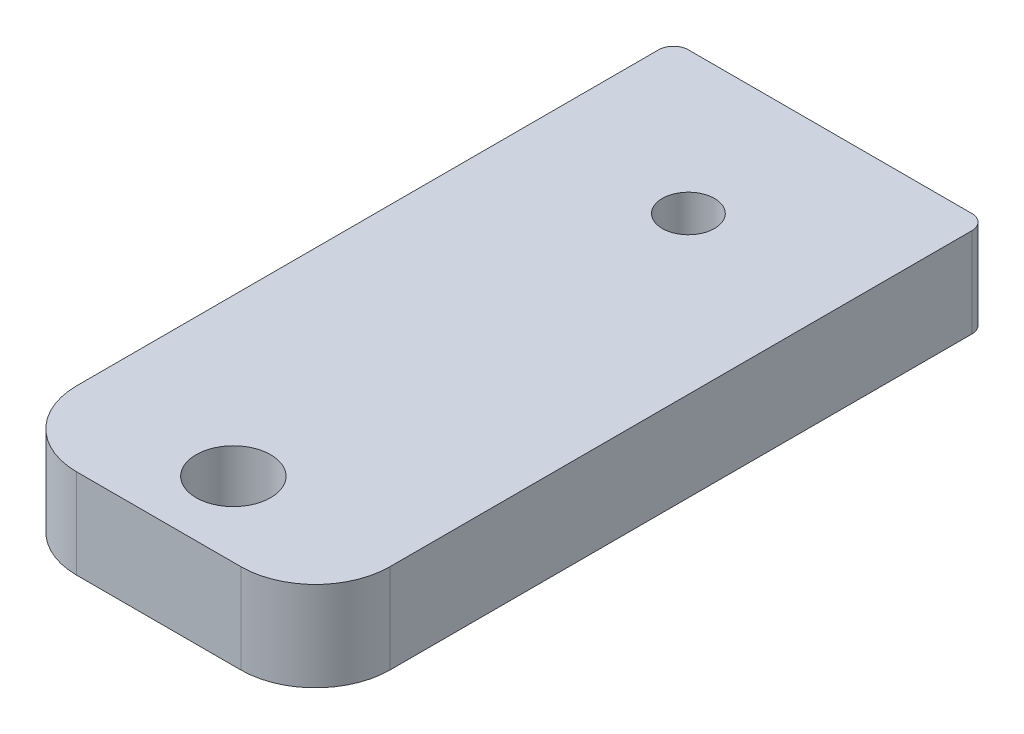
ISO-10303-21;
HEADER;
FILE_DESCRIPTION(('STEP AP214'),'2;1');
FILE_NAME('part.step','',(''),(''),'','','');
FILE_SCHEMA(('AUTOMOTIVE_DESIGN { 1 0 10303 214 1 1 1 1 }'));
ENDSEC;
DATA;
#1=APPLICATION_CONTEXT('core data for automotive mechanical design processes');
#2=APPLICATION_PROTOCOL_DEFINITION('international standard','automotive_design',2000,#1);
#3=PRODUCT_CONTEXT('',#1,'mechanical');
#4=PRODUCT('Part','Part','',(#3));
#5=PRODUCT_RELATED_PRODUCT_CATEGORY('part','',(#4));
#6=PRODUCT_DEFINITION_FORMATION('','',#4);
#7=PRODUCT_DEFINITION_CONTEXT('part definition',#1,'design');
#8=PRODUCT_DEFINITION('design','',#6,#7);
#9=PRODUCT_DEFINITION_SHAPE('','',#8);
#10=(LENGTH_UNIT() NAMED_UNIT(*) SI_UNIT(.MILLI.,.METRE.));
#11=(NAMED_UNIT(*) PLANE_ANGLE_UNIT() SI_UNIT($,.RADIAN.));
#12=(NAMED_UNIT(*) SI_UNIT($,.STERADIAN.) SOLID_ANGLE_UNIT());
#13=UNCERTAINTY_MEASURE_WITH_UNIT(LENGTH_MEASURE(1.E-05),#10,'distance_accuracy_value','');
#14=(GEOMETRIC_REPRESENTATION_CONTEXT(3) GLOBAL_UNCERTAINTY_ASSIGNED_CONTEXT((#13)) GLOBAL_UNIT_ASSIGNED_CONTEXT((#10,
#11,#12)) REPRESENTATION_CONTEXT('',''));
#15=CARTESIAN_POINT('',(0.,0.,0.));
#16=DIRECTION('',(0.,0.,1.));
#17=DIRECTION('',(1.,0.,0.));
#18=AXIS2_PLACEMENT_3D('',#15,#16,#17);
#19=CARTESIAN_POINT('',(5.5,6.,19.5));
#20=DIRECTION('',(0.,1.,0.));
#21=DIRECTION('',(0.,0.,1.));
#22=AXIS2_PLACEMENT_3D('',#19,#20,#21);
#23=PLANE('',#22);
#24=CARTESIAN_POINT('',(0.,6.,-11.));
#25=DIRECTION('',(0.,1.,0.));
#26=DIRECTION('',(0.,0.,1.));
#27=AXIS2_PLACEMENT_3D('',#24,#25,#26);
#28=CIRCLE('',#27,1.75);
#29=CARTESIAN_POINT('',(0.,6.,-9.24999999999999));
#30=VERTEX_POINT('',#29);
#31=EDGE_CURVE('E134',#30,#30,#28,.T.);
#32=ORIENTED_EDGE('',*,*,#31,.F.);
#33=EDGE_LOOP('',(#32));
#34=FACE_BOUND('',#33,.T.);
#35=CARTESIAN_POINT('',(5.5,6.,19.5));
#36=DIRECTION('',(0.,1.,0.));
#37=DIRECTION('',(0.,0.,1.));
#38=AXIS2_PLACEMENT_3D('',#35,#36,#37);
#39=CIRCLE('',#38,5.);
#40=CARTESIAN_POINT('',(5.5,6.,24.5));
#41=VERTEX_POINT('',#40);
#42=CARTESIAN_POINT('',(10.5,6.,19.5));
#43=VERTEX_POINT('',#42);
#44=EDGE_CURVE('E145',#41,#43,#39,.T.);
#45=ORIENTED_EDGE('',*,*,#44,.T.);
#46=DIRECTION('',(0.,0.,-1.));
#47=VECTOR('',#46,1.);
#48=CARTESIAN_POINT('',(10.5,6.,19.5));
#49=LINE('',#48,#47);
#50=CARTESIAN_POINT('',(10.5,6.,-19.5));
#51=VERTEX_POINT('',#50);
#52=EDGE_CURVE('E93',#43,#51,#49,.T.);
#53=ORIENTED_EDGE('',*,*,#52,.T.);
#54=CARTESIAN_POINT('',(9.50000000000001,6.,-19.5));
#55=DIRECTION('',(0.,1.,0.));
#56=DIRECTION('',(0.,0.,-1.));
#57=AXIS2_PLACEMENT_3D('',#54,#55,#56);
#58=CIRCLE('',#57,0.999999999999994);
#59=CARTESIAN_POINT('',(9.50000000000001,6.,-20.5));
#60=VERTEX_POINT('',#59);
#61=EDGE_CURVE('E160',#51,#60,#58,.T.);
#62=ORIENTED_EDGE('',*,*,#61,.T.);
#63=DIRECTION('',(-1.,0.,0.));
#64=VECTOR('',#63,1.);
#65=CARTESIAN_POINT('',(-9.50000000000001,6.,-20.5));
#66=LINE('',#65,#64);
#67=CARTESIAN_POINT('',(-9.50000000000001,6.,-20.5));
#68=VERTEX_POINT('',#67);
#69=EDGE_CURVE('E173',#60,#68,#66,.T.);
#70=ORIENTED_EDGE('',*,*,#69,.T.);
#71=CARTESIAN_POINT('',(-9.50000000000001,6.,-19.5));
#72=DIRECTION('',(0.,1.,0.));
#73=DIRECTION('',(0.,0.,-1.));
#74=AXIS2_PLACEMENT_3D('',#71,#72,#73);
#75=CIRCLE('',#74,0.999999999999994);
#76=CARTESIAN_POINT('',(-10.5,6.,-19.5));
#77=VERTEX_POINT('',#76);
#78=EDGE_CURVE('E112',#68,#77,#75,.T.);
#79=ORIENTED_EDGE('',*,*,#78,.T.);
#80=DIRECTION('',(0.,0.,1.));
#81=VECTOR('',#80,1.);
#82=CARTESIAN_POINT('',(-10.5,6.,19.5));
#83=LINE('',#82,#81);
#84=CARTESIAN_POINT('',(-10.5,6.,19.5));
#85=VERTEX_POINT('',#84);
#86=EDGE_CURVE('E106',#77,#85,#83,.T.);
#87=ORIENTED_EDGE('',*,*,#86,.T.);
#88=CARTESIAN_POINT('',(-5.5,6.,19.5));
#89=DIRECTION('',(0.,1.,0.));
#90=DIRECTION('',(0.,0.,-1.));
#91=AXIS2_PLACEMENT_3D('',#88,#89,#90);
#92=CIRCLE('',#91,5.);
#93=CARTESIAN_POINT('',(-5.49999999999999,6.,24.5));
#94=VERTEX_POINT('',#93);
#95=EDGE_CURVE('E110',#85,#94,#92,.T.);
#96=ORIENTED_EDGE('',*,*,#95,.T.);
#97=DIRECTION('',(1.,0.,0.));
#98=VECTOR('',#97,1.);
#99=CARTESIAN_POINT('',(-5.49999999999999,6.,24.5));
#100=LINE('',#99,#98);
#101=EDGE_CURVE('E50',#94,#41,#100,.T.);
#102=ORIENTED_EDGE('',*,*,#101,.T.);
#103=EDGE_LOOP('',(#45,#53,#62,#70,#79,#87,#96,#102));
#104=FACE_BOUND('',#103,.T.);
#105=CARTESIAN_POINT('',(0.,6.,19.5));
#106=DIRECTION('',(0.,1.,0.));
#107=DIRECTION('',(0.,0.,1.));
#108=AXIS2_PLACEMENT_3D('',#105,#106,#107);
#109=CIRCLE('',#108,2.5);
#110=CARTESIAN_POINT('',(0.,6.,22.));
#111=VERTEX_POINT('',#110);
#112=EDGE_CURVE('E182',#111,#111,#109,.T.);
#113=ORIENTED_EDGE('',*,*,#112,.F.);
#114=EDGE_LOOP('',(#113));
#115=FACE_BOUND('',#114,.T.);
#116=ADVANCED_FACE('F33',(#34,#104,#115),#23,.T.);
#117=CARTESIAN_POINT('',(5.5,0.,19.5));
#118=DIRECTION('',(0.,1.,0.));
#119=DIRECTION('',(0.,0.,1.));
#120=AXIS2_PLACEMENT_3D('',#117,#118,#119);
#121=PLANE('',#120);
#122=CARTESIAN_POINT('',(5.5,0.,19.5));
#123=DIRECTION('',(0.,1.,0.));
#124=DIRECTION('',(0.,0.,1.));
#125=AXIS2_PLACEMENT_3D('',#122,#123,#124);
#126=CIRCLE('',#125,5.);
#127=CARTESIAN_POINT('',(5.5,0.,24.5));
#128=VERTEX_POINT('',#127);
#129=CARTESIAN_POINT('',(10.5,0.,19.5));
#130=VERTEX_POINT('',#129);
#131=EDGE_CURVE('E130',#128,#130,#126,.T.);
#132=ORIENTED_EDGE('',*,*,#131,.F.);
#133=DIRECTION('',(1.,0.,0.));
#134=VECTOR('',#133,1.);
#135=CARTESIAN_POINT('',(-5.49999999999999,0.,24.5));
#136=LINE('',#135,#134);
#137=CARTESIAN_POINT('',(-5.49999999999999,0.,24.5));
#138=VERTEX_POINT('',#137);
#139=EDGE_CURVE('E85',#138,#128,#136,.T.);
#140=ORIENTED_EDGE('',*,*,#139,.F.);
#141=CARTESIAN_POINT('',(-5.5,0.,19.5));
#142=DIRECTION('',(0.,1.,0.));
#143=DIRECTION('',(0.,0.,-1.));
#144=AXIS2_PLACEMENT_3D('',#141,#142,#143);
#145=CIRCLE('',#144,5.);
#146=CARTESIAN_POINT('',(-10.5,0.,19.5));
#147=VERTEX_POINT('',#146);
#148=EDGE_CURVE('E79',#147,#138,#145,.T.);
#149=ORIENTED_EDGE('',*,*,#148,.F.);
#150=DIRECTION('',(0.,0.,1.));
#151=VECTOR('',#150,1.);
#152=CARTESIAN_POINT('',(-10.5,0.,19.5));
#153=LINE('',#152,#151);
#154=CARTESIAN_POINT('',(-10.5,0.,-19.5));
#155=VERTEX_POINT('',#154);
#156=EDGE_CURVE('E120',#155,#147,#153,.T.);
#157=ORIENTED_EDGE('',*,*,#156,.F.);
#158=CARTESIAN_POINT('',(-9.50000000000001,0.,-19.5));
#159=DIRECTION('',(0.,1.,0.));
#160=DIRECTION('',(0.,0.,-1.));
#161=AXIS2_PLACEMENT_3D('',#158,#159,#160);
#162=CIRCLE('',#161,0.999999999999994);
#163=CARTESIAN_POINT('',(-9.50000000000001,0.,-20.5));
#164=VERTEX_POINT('',#163);
#165=EDGE_CURVE('E140',#164,#155,#162,.T.);
#166=ORIENTED_EDGE('',*,*,#165,.F.);
#167=DIRECTION('',(-1.,0.,0.));
#168=VECTOR('',#167,1.);
#169=CARTESIAN_POINT('',(-9.50000000000001,0.,-20.5));
#170=LINE('',#169,#168);
#171=CARTESIAN_POINT('',(9.50000000000001,0.,-20.5));
#172=VERTEX_POINT('',#171);
#173=EDGE_CURVE('E138',#172,#164,#170,.T.);
#174=ORIENTED_EDGE('',*,*,#173,.F.);
#175=CARTESIAN_POINT('',(9.50000000000001,0.,-19.5));
#176=DIRECTION('',(0.,1.,0.));
#177=DIRECTION('',(0.,0.,-1.));
#178=AXIS2_PLACEMENT_3D('',#175,#176,#177);
#179=CIRCLE('',#178,0.999999999999994);
#180=CARTESIAN_POINT('',(10.5,0.,-19.5));
#181=VERTEX_POINT('',#180);
#182=EDGE_CURVE('E136',#181,#172,#179,.T.);
#183=ORIENTED_EDGE('',*,*,#182,.F.);
#184=DIRECTION('',(0.,0.,-1.));
#185=VECTOR('',#184,1.);
#186=CARTESIAN_POINT('',(10.5,0.,19.5));
#187=LINE('',#186,#185);
#188=EDGE_CURVE('E133',#130,#181,#187,.T.);
#189=ORIENTED_EDGE('',*,*,#188,.F.);
#190=EDGE_LOOP('',(#132,#140,#149,#157,#166,#174,#183,#189));
#191=FACE_BOUND('',#190,.T.);
#192=CARTESIAN_POINT('',(0.,0.,-11.));
#193=DIRECTION('',(0.,1.,0.));
#194=DIRECTION('',(0.,0.,1.));
#195=AXIS2_PLACEMENT_3D('',#192,#193,#194);
#196=CIRCLE('',#195,1.75);
#197=CARTESIAN_POINT('',(0.,0.,-9.24999999999999));
#198=VERTEX_POINT('',#197);
#199=EDGE_CURVE('E179',#198,#198,#196,.T.);
#200=ORIENTED_EDGE('',*,*,#199,.T.);
#201=EDGE_LOOP('',(#200));
#202=FACE_BOUND('',#201,.T.);
#203=CARTESIAN_POINT('',(0.,0.,19.5));
#204=DIRECTION('',(0.,1.,0.));
#205=DIRECTION('',(0.,0.,1.));
#206=AXIS2_PLACEMENT_3D('',#203,#204,#205);
#207=CIRCLE('',#206,2.5);
#208=CARTESIAN_POINT('',(0.,0.,22.));
#209=VERTEX_POINT('',#208);
#210=EDGE_CURVE('E185',#209,#209,#207,.T.);
#211=ORIENTED_EDGE('',*,*,#210,.T.);
#212=EDGE_LOOP('',(#211));
#213=FACE_BOUND('',#212,.T.);
#214=ADVANCED_FACE('F164',(#191,#202,#213),#121,.F.);
#215=CARTESIAN_POINT('',(5.5,6.,19.5));
#216=DIRECTION('',(0.,-1.,0.));
#217=DIRECTION('',(0.,0.,-1.));
#218=AXIS2_PLACEMENT_3D('',#215,#216,#217);
#219=CYLINDRICAL_SURFACE('',#218,5.);
#220=ORIENTED_EDGE('',*,*,#131,.T.);
#221=DIRECTION('',(0.,-1.,0.));
#222=VECTOR('',#221,1.);
#223=CARTESIAN_POINT('',(10.5,6.,19.5));
#224=LINE('',#223,#222);
#225=EDGE_CURVE('E11',#43,#130,#224,.T.);
#226=ORIENTED_EDGE('',*,*,#225,.F.);
#227=ORIENTED_EDGE('',*,*,#44,.F.);
#228=DIRECTION('',(0.,-1.,0.));
#229=VECTOR('',#228,1.);
#230=CARTESIAN_POINT('',(5.5,6.,24.5));
#231=LINE('',#230,#229);
#232=EDGE_CURVE('E126',#41,#128,#231,.T.);
#233=ORIENTED_EDGE('',*,*,#232,.T.);
#234=EDGE_LOOP('',(#220,#226,#227,#233));
#235=FACE_BOUND('',#234,.T.);
#236=ADVANCED_FACE('F35',(#235),#219,.T.);
#237=CARTESIAN_POINT('',(10.5,6.,19.5));
#238=DIRECTION('',(-1.,0.,0.));
#239=DIRECTION('',(0.,0.,1.));
#240=AXIS2_PLACEMENT_3D('',#237,#238,#239);
#241=PLANE('',#240);
#242=ORIENTED_EDGE('',*,*,#188,.T.);
#243=DIRECTION('',(0.,-1.,0.));
#244=VECTOR('',#243,1.);
#245=CARTESIAN_POINT('',(10.5,6.,-19.5));
#246=LINE('',#245,#244);
#247=EDGE_CURVE('E42',#51,#181,#246,.T.);
#248=ORIENTED_EDGE('',*,*,#247,.F.);
#249=ORIENTED_EDGE('',*,*,#52,.F.);
#250=ORIENTED_EDGE('',*,*,#225,.T.);
#251=EDGE_LOOP('',(#242,#248,#249,#250));
#252=FACE_BOUND('',#251,.T.);
#253=ADVANCED_FACE('F217',(#252),#241,.F.);
#254=CARTESIAN_POINT('',(9.50000000000001,6.,-19.5));
#255=DIRECTION('',(0.,-1.,0.));
#256=DIRECTION('',(0.,0.,-1.));
#257=AXIS2_PLACEMENT_3D('',#254,#255,#256);
#258=CYLINDRICAL_SURFACE('',#257,0.999999999999994);
#259=ORIENTED_EDGE('',*,*,#182,.T.);
#260=DIRECTION('',(0.,-1.,0.));
#261=VECTOR('',#260,1.);
#262=CARTESIAN_POINT('',(9.50000000000001,6.,-20.5));
#263=LINE('',#262,#261);
#264=EDGE_CURVE('E152',#60,#172,#263,.T.);
#265=ORIENTED_EDGE('',*,*,#264,.F.);
#266=ORIENTED_EDGE('',*,*,#61,.F.);
#267=ORIENTED_EDGE('',*,*,#247,.T.);
#268=EDGE_LOOP('',(#259,#265,#266,#267));
#269=FACE_BOUND('',#268,.T.);
#270=ADVANCED_FACE('F158',(#269),#258,.T.);
#271=CARTESIAN_POINT('',(-9.50000000000001,6.,-20.5));
#272=DIRECTION('',(0.,0.,1.));
#273=DIRECTION('',(1.,0.,0.));
#274=AXIS2_PLACEMENT_3D('',#271,#272,#273);
#275=PLANE('',#274);
#276=ORIENTED_EDGE('',*,*,#173,.T.);
#277=DIRECTION('',(0.,-1.,0.));
#278=VECTOR('',#277,1.);
#279=CARTESIAN_POINT('',(-9.50000000000001,6.,-20.5));
#280=LINE('',#279,#278);
#281=EDGE_CURVE('E149',#68,#164,#280,.T.);
#282=ORIENTED_EDGE('',*,*,#281,.F.);
#283=ORIENTED_EDGE('',*,*,#69,.F.);
#284=ORIENTED_EDGE('',*,*,#264,.T.);
#285=EDGE_LOOP('',(#276,#282,#283,#284));
#286=FACE_BOUND('',#285,.T.);
#287=ADVANCED_FACE('F169',(#286),#275,.F.);
#288=CARTESIAN_POINT('',(-9.50000000000001,6.,-19.5));
#289=DIRECTION('',(0.,-1.,0.));
#290=DIRECTION('',(0.,0.,-1.));
#291=AXIS2_PLACEMENT_3D('',#288,#289,#290);
#292=CYLINDRICAL_SURFACE('',#291,0.999999999999994);
#293=ORIENTED_EDGE('',*,*,#165,.T.);
#294=DIRECTION('',(0.,-1.,0.));
#295=VECTOR('',#294,1.);
#296=CARTESIAN_POINT('',(-10.5,6.,-19.5));
#297=LINE('',#296,#295);
#298=EDGE_CURVE('E121',#77,#155,#297,.T.);
#299=ORIENTED_EDGE('',*,*,#298,.F.);
#300=ORIENTED_EDGE('',*,*,#78,.F.);
#301=ORIENTED_EDGE('',*,*,#281,.T.);
#302=EDGE_LOOP('',(#293,#299,#300,#301));
#303=FACE_BOUND('',#302,.T.);
#304=ADVANCED_FACE('F172',(#303),#292,.T.);
#305=CARTESIAN_POINT('',(-10.5,6.,19.5));
#306=DIRECTION('',(1.,0.,0.));
#307=DIRECTION('',(0.,0.,-1.));
#308=AXIS2_PLACEMENT_3D('',#305,#306,#307);
#309=PLANE('',#308);
#310=ORIENTED_EDGE('',*,*,#156,.T.);
#311=DIRECTION('',(0.,-1.,0.));
#312=VECTOR('',#311,1.);
#313=CARTESIAN_POINT('',(-10.5,6.,19.5));
#314=LINE('',#313,#312);
#315=EDGE_CURVE('E117',#85,#147,#314,.T.);
#316=ORIENTED_EDGE('',*,*,#315,.F.);
#317=ORIENTED_EDGE('',*,*,#86,.F.);
#318=ORIENTED_EDGE('',*,*,#298,.T.);
#319=EDGE_LOOP('',(#310,#316,#317,#318));
#320=FACE_BOUND('',#319,.T.);
#321=ADVANCED_FACE('F118',(#320),#309,.F.);
#322=CARTESIAN_POINT('',(-5.5,6.,19.5));
#323=DIRECTION('',(0.,-1.,0.));
#324=DIRECTION('',(0.,0.,-1.));
#325=AXIS2_PLACEMENT_3D('',#322,#323,#324);
#326=CYLINDRICAL_SURFACE('',#325,5.);
#327=ORIENTED_EDGE('',*,*,#148,.T.);
#328=DIRECTION('',(0.,-1.,0.));
#329=VECTOR('',#328,1.);
#330=CARTESIAN_POINT('',(-5.49999999999999,6.,24.5));
#331=LINE('',#330,#329);
#332=EDGE_CURVE('E122',#94,#138,#331,.T.);
#333=ORIENTED_EDGE('',*,*,#332,.F.);
#334=ORIENTED_EDGE('',*,*,#95,.F.);
#335=ORIENTED_EDGE('',*,*,#315,.T.);
#336=EDGE_LOOP('',(#327,#333,#334,#335));
#337=FACE_BOUND('',#336,.T.);
#338=ADVANCED_FACE('F124',(#337),#326,.T.);
#339=CARTESIAN_POINT('',(-5.49999999999999,6.,24.5));
#340=DIRECTION('',(0.,0.,-1.));
#341=DIRECTION('',(-1.,0.,0.));
#342=AXIS2_PLACEMENT_3D('',#339,#340,#341);
#343=PLANE('',#342);
#344=ORIENTED_EDGE('',*,*,#139,.T.);
#345=ORIENTED_EDGE('',*,*,#232,.F.);
#346=ORIENTED_EDGE('',*,*,#101,.F.);
#347=ORIENTED_EDGE('',*,*,#332,.T.);
#348=EDGE_LOOP('',(#344,#345,#346,#347));
#349=FACE_BOUND('',#348,.T.);
#350=ADVANCED_FACE('F205',(#349),#343,.F.);
#351=CARTESIAN_POINT('',(0.,6.,-11.));
#352=DIRECTION('',(0.,-1.,0.));
#353=DIRECTION('',(0.,0.,-1.));
#354=AXIS2_PLACEMENT_3D('',#351,#352,#353);
#355=CYLINDRICAL_SURFACE('',#354,1.75);
#356=ORIENTED_EDGE('',*,*,#31,.T.);
#357=EDGE_LOOP('',(#356));
#358=FACE_BOUND('',#357,.T.);
#359=ORIENTED_EDGE('',*,*,#199,.F.);
#360=EDGE_LOOP('',(#359));
#361=FACE_BOUND('',#360,.T.);
#362=ADVANCED_FACE('F202',(#358,#361),#355,.F.);
#363=CARTESIAN_POINT('',(0.,6.,19.5));
#364=DIRECTION('',(0.,-1.,0.));
#365=DIRECTION('',(0.,0.,-1.));
#366=AXIS2_PLACEMENT_3D('',#363,#364,#365);
#367=CYLINDRICAL_SURFACE('',#366,2.5);
#368=ORIENTED_EDGE('',*,*,#112,.T.);
#369=EDGE_LOOP('',(#368));
#370=FACE_BOUND('',#369,.T.);
#371=ORIENTED_EDGE('',*,*,#210,.F.);
#372=EDGE_LOOP('',(#371));
#373=FACE_BOUND('',#372,.T.);
#374=ADVANCED_FACE('F191',(#370,#373),#367,.F.);
#375=CLOSED_SHELL('',(#116,#214,#236,#253,#270,#287,#304,#321,#338,#350,#362,#374));
#376=MANIFOLD_SOLID_BREP('B2',#375);
#377=ADVANCED_BREP_SHAPE_REPRESENTATION('',(#18,#376),#14);
#378=SHAPE_DEFINITION_REPRESENTATION(#9,#377);
ENDSEC;
END-ISO-10303-21;
